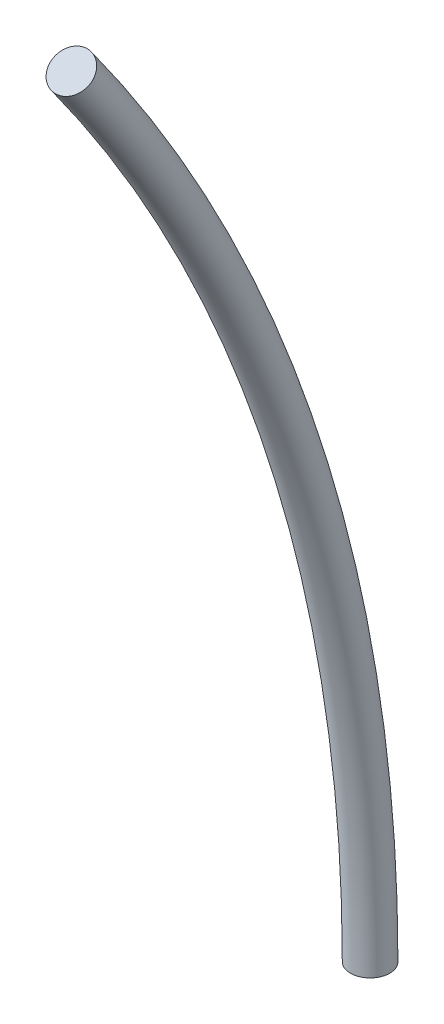
ISO-10303-21;
HEADER;
FILE_DESCRIPTION(('STEP AP214'),'2;1');
FILE_NAME('part.step','',(''),(''),'','','');
FILE_SCHEMA(('AUTOMOTIVE_DESIGN { 1 0 10303 214 1 1 1 1 }'));
ENDSEC;
DATA;
#1=APPLICATION_CONTEXT('core data for automotive mechanical design processes');
#2=APPLICATION_PROTOCOL_DEFINITION('international standard','automotive_design',2000,#1);
#3=PRODUCT_CONTEXT('',#1,'mechanical');
#4=PRODUCT('Part','Part','',(#3));
#5=PRODUCT_RELATED_PRODUCT_CATEGORY('part','',(#4));
#6=PRODUCT_DEFINITION_FORMATION('','',#4);
#7=PRODUCT_DEFINITION_CONTEXT('part definition',#1,'design');
#8=PRODUCT_DEFINITION('design','',#6,#7);
#9=PRODUCT_DEFINITION_SHAPE('','',#8);
#10=(LENGTH_UNIT() NAMED_UNIT(*) SI_UNIT(.MILLI.,.METRE.));
#11=(NAMED_UNIT(*) PLANE_ANGLE_UNIT() SI_UNIT($,.RADIAN.));
#12=(NAMED_UNIT(*) SI_UNIT($,.STERADIAN.) SOLID_ANGLE_UNIT());
#13=UNCERTAINTY_MEASURE_WITH_UNIT(LENGTH_MEASURE(1.E-05),#10,'distance_accuracy_value','');
#14=(GEOMETRIC_REPRESENTATION_CONTEXT(3) GLOBAL_UNCERTAINTY_ASSIGNED_CONTEXT((#13)) GLOBAL_UNIT_ASSIGNED_CONTEXT((#10,
#11,#12)) REPRESENTATION_CONTEXT('',''));
#15=CARTESIAN_POINT('',(0.,0.,0.));
#16=DIRECTION('',(0.,0.,1.));
#17=DIRECTION('',(1.,0.,0.));
#18=AXIS2_PLACEMENT_3D('',#15,#16,#17);
#19=CARTESIAN_POINT('',(0.,0.,239.051514105913));
#20=DIRECTION('',(-1.,0.,0.));
#21=DIRECTION('',(0.,0.,1.));
#22=AXIS2_PLACEMENT_3D('',#19,#20,#21);
#23=TOROIDAL_SURFACE('',#22,239.051514105913,3.);
#24=CARTESIAN_POINT('',(0.,140.348700368508,45.5369960427967));
#25=DIRECTION('',(0.,0.809509694121321,0.58710651088504));
#26=DIRECTION('',(0.,-0.58710651088504,0.809509694121321));
#27=AXIS2_PLACEMENT_3D('',#24,#25,#26);
#28=CIRCLE('',#27,3.);
#29=CARTESIAN_POINT('',(0.,142.110019901164,43.1084669604327));
#30=VERTEX_POINT('',#29);
#31=EDGE_CURVE('E10',#30,#30,#28,.T.);
#32=CARTESIAN_POINT('',(0.,0.,0.));
#33=DIRECTION('',(0.,1.,0.));
#34=DIRECTION('',(0.,0.,1.));
#35=AXIS2_PLACEMENT_3D('',#32,#33,#34);
#36=CIRCLE('',#35,3.);
#37=CARTESIAN_POINT('',(0.,0.,-3.));
#38=VERTEX_POINT('',#37);
#39=EDGE_CURVE('E39',#38,#38,#36,.T.);
#40=CARTESIAN_POINT('',(0.,0.,239.051514105913));
#41=DIRECTION('',(-1.,0.,0.));
#42=DIRECTION('',(0.,0.,1.));
#43=AXIS2_PLACEMENT_3D('',#40,#41,#42);
#44=CIRCLE('',#43,242.051514105913);
#45=EDGE_CURVE('',#30,#38,#44,.T.);
#46=ORIENTED_EDGE('',*,*,#31,.F.);
#47=ORIENTED_EDGE('',*,*,#39,.T.);
#48=ORIENTED_EDGE('',*,*,#45,.T.);
#49=ORIENTED_EDGE('',*,*,#45,.F.);
#50=EDGE_LOOP('',(#46,#48,#47,#49));
#51=FACE_BOUND('',#50,.T.);
#52=ADVANCED_FACE('F33',(#51),#23,.T.);
#53=CARTESIAN_POINT('',(0.,140.348700368508,45.5369960427967));
#54=DIRECTION('',(0.,0.809509694121321,0.58710651088504));
#55=DIRECTION('',(0.,-0.58710651088504,0.809509694121321));
#56=AXIS2_PLACEMENT_3D('',#53,#54,#55);
#57=PLANE('',#56);
#58=ORIENTED_EDGE('',*,*,#31,.T.);
#59=EDGE_LOOP('',(#58));
#60=FACE_BOUND('',#59,.T.);
#61=ADVANCED_FACE('F48',(#60),#57,.T.);
#62=CARTESIAN_POINT('',(0.,0.,0.));
#63=DIRECTION('',(0.,1.,0.));
#64=DIRECTION('',(0.,0.,1.));
#65=AXIS2_PLACEMENT_3D('',#62,#63,#64);
#66=PLANE('',#65);
#67=ORIENTED_EDGE('',*,*,#39,.F.);
#68=EDGE_LOOP('',(#67));
#69=FACE_BOUND('',#68,.T.);
#70=ADVANCED_FACE('F46',(#69),#66,.F.);
#71=CLOSED_SHELL('',(#52,#61,#70));
#72=MANIFOLD_SOLID_BREP('B2',#71);
#73=ADVANCED_BREP_SHAPE_REPRESENTATION('',(#18,#72),#14);
#74=SHAPE_DEFINITION_REPRESENTATION(#9,#73);
ENDSEC;
END-ISO-10303-21;
